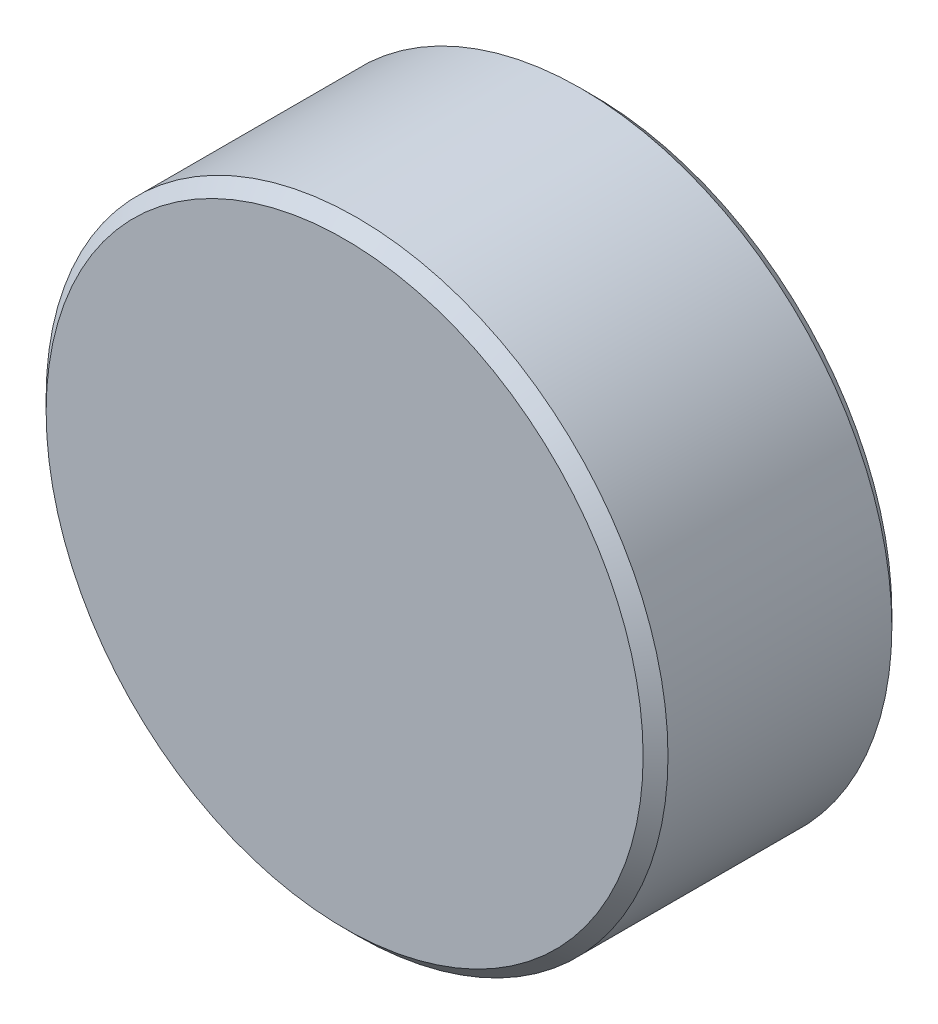
ISO-10303-21;
HEADER;
FILE_DESCRIPTION(('STEP AP214'),'2;1');
FILE_NAME('part.step','',(''),(''),'','','');
FILE_SCHEMA(('AUTOMOTIVE_DESIGN { 1 0 10303 214 1 1 1 1 }'));
ENDSEC;
DATA;
#1=APPLICATION_CONTEXT('core data for automotive mechanical design processes');
#2=APPLICATION_PROTOCOL_DEFINITION('international standard','automotive_design',2000,#1);
#3=PRODUCT_CONTEXT('',#1,'mechanical');
#4=PRODUCT('Part','Part','',(#3));
#5=PRODUCT_RELATED_PRODUCT_CATEGORY('part','',(#4));
#6=PRODUCT_DEFINITION_FORMATION('','',#4);
#7=PRODUCT_DEFINITION_CONTEXT('part definition',#1,'design');
#8=PRODUCT_DEFINITION('design','',#6,#7);
#9=PRODUCT_DEFINITION_SHAPE('','',#8);
#10=(LENGTH_UNIT() NAMED_UNIT(*) SI_UNIT(.MILLI.,.METRE.));
#11=(NAMED_UNIT(*) PLANE_ANGLE_UNIT() SI_UNIT($,.RADIAN.));
#12=(NAMED_UNIT(*) SI_UNIT($,.STERADIAN.) SOLID_ANGLE_UNIT());
#13=UNCERTAINTY_MEASURE_WITH_UNIT(LENGTH_MEASURE(1.E-05),#10,'distance_accuracy_value','');
#14=(GEOMETRIC_REPRESENTATION_CONTEXT(3) GLOBAL_UNCERTAINTY_ASSIGNED_CONTEXT((#13)) GLOBAL_UNIT_ASSIGNED_CONTEXT((#10,
#11,#12)) REPRESENTATION_CONTEXT('',''));
#15=CARTESIAN_POINT('',(0.,0.,0.));
#16=DIRECTION('',(0.,0.,1.));
#17=DIRECTION('',(1.,0.,0.));
#18=AXIS2_PLACEMENT_3D('',#15,#16,#17);
#19=CARTESIAN_POINT('',(0.,0.,2.54));
#20=DIRECTION('',(0.,0.,-1.));
#21=DIRECTION('',(-1.,0.,0.));
#22=AXIS2_PLACEMENT_3D('',#19,#20,#21);
#23=CYLINDRICAL_SURFACE('',#22,3.175);
#24=CARTESIAN_POINT('',(0.,0.,0.127000000000002));
#25=DIRECTION('',(0.,0.,1.));
#26=DIRECTION('',(1.,0.,0.));
#27=AXIS2_PLACEMENT_3D('',#24,#25,#26);
#28=CIRCLE('',#27,3.175);
#29=CARTESIAN_POINT('',(3.175,0.,0.127000000000002));
#30=VERTEX_POINT('',#29);
#31=EDGE_CURVE('E53',#30,#30,#28,.T.);
#32=ORIENTED_EDGE('',*,*,#31,.T.);
#33=EDGE_LOOP('',(#32));
#34=FACE_BOUND('',#33,.T.);
#35=CARTESIAN_POINT('',(0.,0.,2.413));
#36=DIRECTION('',(0.,0.,1.));
#37=DIRECTION('',(1.,0.,0.));
#38=AXIS2_PLACEMENT_3D('',#35,#36,#37);
#39=CIRCLE('',#38,3.175);
#40=CARTESIAN_POINT('',(3.175,0.,2.413));
#41=VERTEX_POINT('',#40);
#42=EDGE_CURVE('E57',#41,#41,#39,.F.);
#43=ORIENTED_EDGE('',*,*,#42,.T.);
#44=EDGE_LOOP('',(#43));
#45=FACE_BOUND('',#44,.T.);
#46=ADVANCED_FACE('F42',(#34,#45),#23,.T.);
#47=CARTESIAN_POINT('',(0.,0.,2.54));
#48=DIRECTION('',(0.,0.,1.));
#49=DIRECTION('',(1.,0.,0.));
#50=AXIS2_PLACEMENT_3D('',#47,#48,#49);
#51=PLANE('',#50);
#52=CARTESIAN_POINT('',(0.,0.,2.54));
#53=DIRECTION('',(0.,0.,1.));
#54=DIRECTION('',(1.,0.,0.));
#55=AXIS2_PLACEMENT_3D('',#52,#53,#54);
#56=CIRCLE('',#55,3.048);
#57=CARTESIAN_POINT('',(3.048,0.,2.54));
#58=VERTEX_POINT('',#57);
#59=EDGE_CURVE('E12',#58,#58,#56,.T.);
#60=ORIENTED_EDGE('',*,*,#59,.T.);
#61=EDGE_LOOP('',(#60));
#62=FACE_BOUND('',#61,.T.);
#63=ADVANCED_FACE('F73',(#62),#51,.T.);
#64=CARTESIAN_POINT('',(0.,0.,0.));
#65=DIRECTION('',(0.,0.,1.));
#66=DIRECTION('',(1.,0.,0.));
#67=AXIS2_PLACEMENT_3D('',#64,#65,#66);
#68=PLANE('',#67);
#69=CARTESIAN_POINT('',(0.,0.,0.));
#70=DIRECTION('',(0.,0.,1.));
#71=DIRECTION('',(1.,0.,0.));
#72=AXIS2_PLACEMENT_3D('',#69,#70,#71);
#73=CIRCLE('',#72,3.048);
#74=CARTESIAN_POINT('',(3.048,0.,0.));
#75=VERTEX_POINT('',#74);
#76=EDGE_CURVE('E49',#75,#75,#73,.F.);
#77=ORIENTED_EDGE('',*,*,#76,.T.);
#78=EDGE_LOOP('',(#77));
#79=FACE_BOUND('',#78,.T.);
#80=ADVANCED_FACE('F70',(#79),#68,.F.);
#81=CARTESIAN_POINT('',(0.,0.,0.127000000000002));
#82=DIRECTION('',(0.,0.,1.));
#83=DIRECTION('',(1.,0.,0.));
#84=AXIS2_PLACEMENT_3D('',#81,#82,#83);
#85=CONICAL_SURFACE('',#84,3.175,0.78539816339745);
#86=ORIENTED_EDGE('',*,*,#76,.F.);
#87=EDGE_LOOP('',(#86));
#88=FACE_BOUND('',#87,.T.);
#89=ORIENTED_EDGE('',*,*,#31,.F.);
#90=EDGE_LOOP('',(#89));
#91=FACE_BOUND('',#90,.T.);
#92=ADVANCED_FACE('F66',(#88,#91),#85,.T.);
#93=CARTESIAN_POINT('',(0.,0.,2.54));
#94=DIRECTION('',(0.,0.,-1.));
#95=DIRECTION('',(-1.,0.,0.));
#96=AXIS2_PLACEMENT_3D('',#93,#94,#95);
#97=CONICAL_SURFACE('',#96,3.048,0.785398163397447);
#98=ORIENTED_EDGE('',*,*,#42,.F.);
#99=EDGE_LOOP('',(#98));
#100=FACE_BOUND('',#99,.T.);
#101=ORIENTED_EDGE('',*,*,#59,.F.);
#102=EDGE_LOOP('',(#101));
#103=FACE_BOUND('',#102,.T.);
#104=ADVANCED_FACE('F44',(#100,#103),#97,.T.);
#105=CLOSED_SHELL('',(#46,#63,#80,#92,#104));
#106=MANIFOLD_SOLID_BREP('B2',#105);
#107=ADVANCED_BREP_SHAPE_REPRESENTATION('',(#18,#106),#14);
#108=SHAPE_DEFINITION_REPRESENTATION(#9,#107);
ENDSEC;
END-ISO-10303-21;
